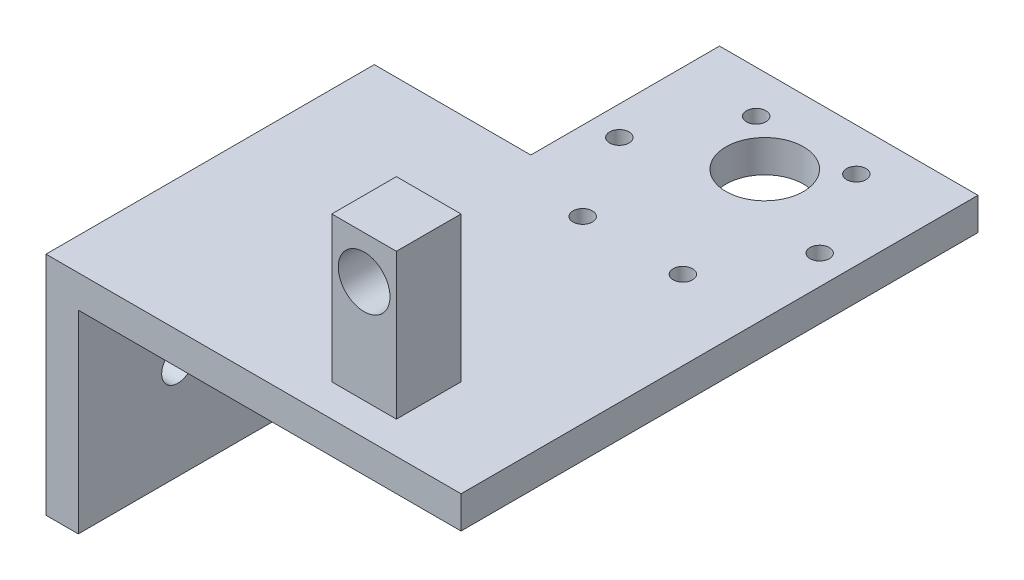
ISO-10303-21;
HEADER;
FILE_DESCRIPTION(('STEP AP214'),'2;1');
FILE_NAME('part.step','',(''),(''),'','','');
FILE_SCHEMA(('AUTOMOTIVE_DESIGN { 1 0 10303 214 1 1 1 1 }'));
ENDSEC;
DATA;
#1=APPLICATION_CONTEXT('core data for automotive mechanical design processes');
#2=APPLICATION_PROTOCOL_DEFINITION('international standard','automotive_design',2000,#1);
#3=PRODUCT_CONTEXT('',#1,'mechanical');
#4=PRODUCT('Part','Part','',(#3));
#5=PRODUCT_RELATED_PRODUCT_CATEGORY('part','',(#4));
#6=PRODUCT_DEFINITION_FORMATION('','',#4);
#7=PRODUCT_DEFINITION_CONTEXT('part definition',#1,'design');
#8=PRODUCT_DEFINITION('design','',#6,#7);
#9=PRODUCT_DEFINITION_SHAPE('','',#8);
#10=(LENGTH_UNIT() NAMED_UNIT(*) SI_UNIT(.MILLI.,.METRE.));
#11=(NAMED_UNIT(*) PLANE_ANGLE_UNIT() SI_UNIT($,.RADIAN.));
#12=(NAMED_UNIT(*) SI_UNIT($,.STERADIAN.) SOLID_ANGLE_UNIT());
#13=UNCERTAINTY_MEASURE_WITH_UNIT(LENGTH_MEASURE(1.E-05),#10,'distance_accuracy_value','');
#14=(GEOMETRIC_REPRESENTATION_CONTEXT(3) GLOBAL_UNCERTAINTY_ASSIGNED_CONTEXT((#13)) GLOBAL_UNIT_ASSIGNED_CONTEXT((#10,
#11,#12)) REPRESENTATION_CONTEXT('',''));
#15=CARTESIAN_POINT('',(0.,0.,0.));
#16=DIRECTION('',(0.,0.,1.));
#17=DIRECTION('',(1.,0.,0.));
#18=AXIS2_PLACEMENT_3D('',#15,#16,#17);
#19=CARTESIAN_POINT('',(0.,0.,0.));
#20=DIRECTION('',(0.,1.,0.));
#21=DIRECTION('',(0.,0.,1.));
#22=AXIS2_PLACEMENT_3D('',#19,#20,#21);
#23=PLANE('',#22);
#24=CARTESIAN_POINT('',(-15.5,0.,0.));
#25=DIRECTION('',(0.,1.,0.));
#26=DIRECTION('',(0.,0.,1.));
#27=AXIS2_PLACEMENT_3D('',#24,#25,#26);
#28=CIRCLE('',#27,1.5);
#29=CARTESIAN_POINT('',(-15.5,0.,1.5));
#30=VERTEX_POINT('',#29);
#31=EDGE_CURVE('E232',#30,#30,#28,.T.);
#32=ORIENTED_EDGE('',*,*,#31,.T.);
#33=EDGE_LOOP('',(#32));
#34=FACE_BOUND('',#33,.T.);
#35=CARTESIAN_POINT('',(7.75000000000006,0.,-13.4233937586588));
#36=DIRECTION('',(0.,1.,0.));
#37=DIRECTION('',(0.,0.,1.));
#38=AXIS2_PLACEMENT_3D('',#35,#36,#37);
#39=CIRCLE('',#38,1.5);
#40=CARTESIAN_POINT('',(7.75000000000006,0.,-11.9233937586588));
#41=VERTEX_POINT('',#40);
#42=EDGE_CURVE('E202',#41,#41,#39,.T.);
#43=ORIENTED_EDGE('',*,*,#42,.T.);
#44=EDGE_LOOP('',(#43));
#45=FACE_BOUND('',#44,.T.);
#46=CARTESIAN_POINT('',(-7.74999999999997,0.,-13.4233937586588));
#47=DIRECTION('',(0.,1.,0.));
#48=DIRECTION('',(0.,0.,1.));
#49=AXIS2_PLACEMENT_3D('',#46,#47,#48);
#50=CIRCLE('',#49,1.5);
#51=CARTESIAN_POINT('',(-7.74999999999997,0.,-11.9233937586588));
#52=VERTEX_POINT('',#51);
#53=EDGE_CURVE('E221',#52,#52,#50,.T.);
#54=ORIENTED_EDGE('',*,*,#53,.T.);
#55=EDGE_LOOP('',(#54));
#56=FACE_BOUND('',#55,.T.);
#57=CARTESIAN_POINT('',(0.,0.,-7.));
#58=DIRECTION('',(0.,1.,0.));
#59=DIRECTION('',(0.,0.,1.));
#60=AXIS2_PLACEMENT_3D('',#57,#58,#59);
#61=CIRCLE('',#60,6.);
#62=CARTESIAN_POINT('',(0.,0.,-0.999999999999999));
#63=VERTEX_POINT('',#62);
#64=EDGE_CURVE('E220',#63,#63,#61,.T.);
#65=ORIENTED_EDGE('',*,*,#64,.T.);
#66=EDGE_LOOP('',(#65));
#67=FACE_BOUND('',#66,.T.);
#68=CARTESIAN_POINT('',(15.5,0.,1.08235921504137E-13));
#69=DIRECTION('',(0.,1.,0.));
#70=DIRECTION('',(0.,0.,1.));
#71=AXIS2_PLACEMENT_3D('',#68,#69,#70);
#72=CIRCLE('',#71,1.5);
#73=CARTESIAN_POINT('',(15.5,0.,1.50000000000011));
#74=VERTEX_POINT('',#73);
#75=EDGE_CURVE('E203',#74,#74,#72,.T.);
#76=ORIENTED_EDGE('',*,*,#75,.T.);
#77=EDGE_LOOP('',(#76));
#78=FACE_BOUND('',#77,.T.);
#79=CARTESIAN_POINT('',(7.74999999999987,0.,13.4233937586589));
#80=DIRECTION('',(0.,1.,0.));
#81=DIRECTION('',(0.,0.,1.));
#82=AXIS2_PLACEMENT_3D('',#79,#80,#81);
#83=CIRCLE('',#82,1.5);
#84=CARTESIAN_POINT('',(7.74999999999987,0.,14.9233937586589));
#85=VERTEX_POINT('',#84);
#86=EDGE_CURVE('E209',#85,#85,#83,.T.);
#87=ORIENTED_EDGE('',*,*,#86,.T.);
#88=EDGE_LOOP('',(#87));
#89=FACE_BOUND('',#88,.T.);
#90=CARTESIAN_POINT('',(-7.75000000000016,0.,13.4233937586587));
#91=DIRECTION('',(0.,1.,0.));
#92=DIRECTION('',(0.,0.,1.));
#93=AXIS2_PLACEMENT_3D('',#90,#91,#92);
#94=CIRCLE('',#93,1.5);
#95=CARTESIAN_POINT('',(-7.75000000000016,0.,14.9233937586587));
#96=VERTEX_POINT('',#95);
#97=EDGE_CURVE('E198',#96,#96,#94,.T.);
#98=ORIENTED_EDGE('',*,*,#97,.T.);
#99=EDGE_LOOP('',(#98));
#100=FACE_BOUND('',#99,.T.);
#101=DIRECTION('',(0.,0.,1.));
#102=VECTOR('',#101,1.);
#103=CARTESIAN_POINT('',(-39.225,0.,9.2));
#104=LINE('',#103,#102);
#105=CARTESIAN_POINT('',(-39.225,0.,9.2));
#106=VERTEX_POINT('',#105);
#107=CARTESIAN_POINT('',(-39.225,0.,60.));
#108=VERTEX_POINT('',#107);
#109=EDGE_CURVE('E48',#106,#108,#104,.T.);
#110=ORIENTED_EDGE('',*,*,#109,.F.);
#111=DIRECTION('',(1.,0.,0.));
#112=VECTOR('',#111,1.);
#113=CARTESIAN_POINT('',(-44.225,0.,9.2));
#114=LINE('',#113,#112);
#115=CARTESIAN_POINT('',(-20.,0.,9.2));
#116=VERTEX_POINT('',#115);
#117=EDGE_CURVE('E146',#106,#116,#114,.T.);
#118=ORIENTED_EDGE('',*,*,#117,.T.);
#119=DIRECTION('',(0.,0.,1.));
#120=VECTOR('',#119,1.);
#121=CARTESIAN_POINT('',(-20.,0.,-20.));
#122=LINE('',#121,#120);
#123=CARTESIAN_POINT('',(-20.,0.,-20.));
#124=VERTEX_POINT('',#123);
#125=EDGE_CURVE('E238',#124,#116,#122,.T.);
#126=ORIENTED_EDGE('',*,*,#125,.F.);
#127=DIRECTION('',(-1.,0.,0.));
#128=VECTOR('',#127,1.);
#129=CARTESIAN_POINT('',(-20.,0.,-20.));
#130=LINE('',#129,#128);
#131=CARTESIAN_POINT('',(20.,0.,-20.));
#132=VERTEX_POINT('',#131);
#133=EDGE_CURVE('E244',#132,#124,#130,.T.);
#134=ORIENTED_EDGE('',*,*,#133,.F.);
#135=DIRECTION('',(0.,0.,-1.));
#136=VECTOR('',#135,1.);
#137=CARTESIAN_POINT('',(20.,0.,-20.));
#138=LINE('',#137,#136);
#139=CARTESIAN_POINT('',(20.,0.,60.));
#140=VERTEX_POINT('',#139);
#141=EDGE_CURVE('E254',#140,#132,#138,.T.);
#142=ORIENTED_EDGE('',*,*,#141,.F.);
#143=DIRECTION('',(1.,0.,0.));
#144=VECTOR('',#143,1.);
#145=CARTESIAN_POINT('',(-20.,0.,60.));
#146=LINE('',#145,#144);
#147=EDGE_CURVE('E252',#108,#140,#146,.T.);
#148=ORIENTED_EDGE('',*,*,#147,.F.);
#149=EDGE_LOOP('',(#110,#118,#126,#134,#142,#148));
#150=FACE_BOUND('',#149,.T.);
#151=ADVANCED_FACE('F33',(#34,#45,#56,#67,#78,#89,#100,#150),#23,.F.);
#152=CARTESIAN_POINT('',(-20.,5.,-20.));
#153=DIRECTION('',(1.,0.,0.));
#154=DIRECTION('',(0.,0.,-1.));
#155=AXIS2_PLACEMENT_3D('',#152,#153,#154);
#156=PLANE('',#155);
#157=DIRECTION('',(0.,-1.,0.));
#158=VECTOR('',#157,1.);
#159=CARTESIAN_POINT('',(-20.,0.,9.2));
#160=LINE('',#159,#158);
#161=CARTESIAN_POINT('',(-20.,5.,9.2));
#162=VERTEX_POINT('',#161);
#163=EDGE_CURVE('E56',#162,#116,#160,.T.);
#164=ORIENTED_EDGE('',*,*,#163,.F.);
#165=DIRECTION('',(0.,0.,1.));
#166=VECTOR('',#165,1.);
#167=CARTESIAN_POINT('',(-20.,5.,-20.));
#168=LINE('',#167,#166);
#169=CARTESIAN_POINT('',(-20.,5.,-20.));
#170=VERTEX_POINT('',#169);
#171=EDGE_CURVE('E241',#170,#162,#168,.T.);
#172=ORIENTED_EDGE('',*,*,#171,.F.);
#173=DIRECTION('',(0.,-1.,0.));
#174=VECTOR('',#173,1.);
#175=CARTESIAN_POINT('',(-20.,5.,-20.));
#176=LINE('',#175,#174);
#177=EDGE_CURVE('E250',#170,#124,#176,.T.);
#178=ORIENTED_EDGE('',*,*,#177,.T.);
#179=ORIENTED_EDGE('',*,*,#125,.T.);
#180=EDGE_LOOP('',(#164,#172,#178,#179));
#181=FACE_BOUND('',#180,.T.);
#182=ADVANCED_FACE('F35',(#181),#156,.F.);
#183=CARTESIAN_POINT('',(0.,5.,0.));
#184=DIRECTION('',(0.,1.,0.));
#185=DIRECTION('',(0.,0.,1.));
#186=AXIS2_PLACEMENT_3D('',#183,#184,#185);
#187=PLANE('',#186);
#188=CARTESIAN_POINT('',(-7.75000000000016,5.,13.4233937586587));
#189=DIRECTION('',(0.,1.,0.));
#190=DIRECTION('',(0.,0.,1.));
#191=AXIS2_PLACEMENT_3D('',#188,#189,#190);
#192=CIRCLE('',#191,1.5);
#193=CARTESIAN_POINT('',(-7.75000000000016,5.,14.9233937586587));
#194=VERTEX_POINT('',#193);
#195=EDGE_CURVE('E212',#194,#194,#192,.T.);
#196=ORIENTED_EDGE('',*,*,#195,.F.);
#197=EDGE_LOOP('',(#196));
#198=FACE_BOUND('',#197,.T.);
#199=CARTESIAN_POINT('',(7.74999999999987,5.,13.4233937586589));
#200=DIRECTION('',(0.,1.,0.));
#201=DIRECTION('',(0.,0.,1.));
#202=AXIS2_PLACEMENT_3D('',#199,#200,#201);
#203=CIRCLE('',#202,1.5);
#204=CARTESIAN_POINT('',(7.74999999999987,5.,14.9233937586589));
#205=VERTEX_POINT('',#204);
#206=EDGE_CURVE('E206',#205,#205,#203,.T.);
#207=ORIENTED_EDGE('',*,*,#206,.F.);
#208=EDGE_LOOP('',(#207));
#209=FACE_BOUND('',#208,.T.);
#210=CARTESIAN_POINT('',(15.5,5.,1.08235921504137E-13));
#211=DIRECTION('',(0.,1.,0.));
#212=DIRECTION('',(0.,0.,1.));
#213=AXIS2_PLACEMENT_3D('',#210,#211,#212);
#214=CIRCLE('',#213,1.5);
#215=CARTESIAN_POINT('',(15.5,5.,1.50000000000011));
#216=VERTEX_POINT('',#215);
#217=EDGE_CURVE('E199',#216,#216,#214,.T.);
#218=ORIENTED_EDGE('',*,*,#217,.F.);
#219=EDGE_LOOP('',(#218));
#220=FACE_BOUND('',#219,.T.);
#221=CARTESIAN_POINT('',(0.,5.,-7.));
#222=DIRECTION('',(0.,1.,0.));
#223=DIRECTION('',(0.,0.,1.));
#224=AXIS2_PLACEMENT_3D('',#221,#222,#223);
#225=CIRCLE('',#224,6.);
#226=CARTESIAN_POINT('',(0.,5.,-0.999999999999999));
#227=VERTEX_POINT('',#226);
#228=EDGE_CURVE('E229',#227,#227,#225,.T.);
#229=ORIENTED_EDGE('',*,*,#228,.F.);
#230=EDGE_LOOP('',(#229));
#231=FACE_BOUND('',#230,.T.);
#232=CARTESIAN_POINT('',(-7.74999999999997,5.,-13.4233937586588));
#233=DIRECTION('',(0.,1.,0.));
#234=DIRECTION('',(0.,0.,1.));
#235=AXIS2_PLACEMENT_3D('',#232,#233,#234);
#236=CIRCLE('',#235,1.5);
#237=CARTESIAN_POINT('',(-7.74999999999997,5.,-11.9233937586588));
#238=VERTEX_POINT('',#237);
#239=EDGE_CURVE('E217',#238,#238,#236,.T.);
#240=ORIENTED_EDGE('',*,*,#239,.F.);
#241=EDGE_LOOP('',(#240));
#242=FACE_BOUND('',#241,.T.);
#243=CARTESIAN_POINT('',(7.75000000000006,5.,-13.4233937586588));
#244=DIRECTION('',(0.,1.,0.));
#245=DIRECTION('',(0.,0.,1.));
#246=AXIS2_PLACEMENT_3D('',#243,#244,#245);
#247=CIRCLE('',#246,1.5);
#248=CARTESIAN_POINT('',(7.75000000000006,5.,-11.9233937586588));
#249=VERTEX_POINT('',#248);
#250=EDGE_CURVE('E224',#249,#249,#247,.T.);
#251=ORIENTED_EDGE('',*,*,#250,.F.);
#252=EDGE_LOOP('',(#251));
#253=FACE_BOUND('',#252,.T.);
#254=CARTESIAN_POINT('',(-15.5,5.,0.));
#255=DIRECTION('',(0.,1.,0.));
#256=DIRECTION('',(0.,0.,1.));
#257=AXIS2_PLACEMENT_3D('',#254,#255,#256);
#258=CIRCLE('',#257,1.5);
#259=CARTESIAN_POINT('',(-15.5,5.,1.5));
#260=VERTEX_POINT('',#259);
#261=EDGE_CURVE('E235',#260,#260,#258,.T.);
#262=ORIENTED_EDGE('',*,*,#261,.F.);
#263=EDGE_LOOP('',(#262));
#264=FACE_BOUND('',#263,.T.);
#265=ORIENTED_EDGE('',*,*,#171,.T.);
#266=DIRECTION('',(1.,0.,0.));
#267=VECTOR('',#266,1.);
#268=CARTESIAN_POINT('',(-44.225,5.,9.2));
#269=LINE('',#268,#267);
#270=CARTESIAN_POINT('',(-44.225,5.,9.2));
#271=VERTEX_POINT('',#270);
#272=EDGE_CURVE('E160',#271,#162,#269,.T.);
#273=ORIENTED_EDGE('',*,*,#272,.F.);
#274=DIRECTION('',(0.,0.,-1.));
#275=VECTOR('',#274,1.);
#276=CARTESIAN_POINT('',(-44.225,5.,60.));
#277=LINE('',#276,#275);
#278=CARTESIAN_POINT('',(-44.225,5.,60.));
#279=VERTEX_POINT('',#278);
#280=EDGE_CURVE('E155',#279,#271,#277,.T.);
#281=ORIENTED_EDGE('',*,*,#280,.F.);
#282=DIRECTION('',(1.,0.,0.));
#283=VECTOR('',#282,1.);
#284=CARTESIAN_POINT('',(-20.,5.,60.));
#285=LINE('',#284,#283);
#286=CARTESIAN_POINT('',(20.,5.,60.));
#287=VERTEX_POINT('',#286);
#288=EDGE_CURVE('E243',#279,#287,#285,.T.);
#289=ORIENTED_EDGE('',*,*,#288,.T.);
#290=DIRECTION('',(0.,0.,-1.));
#291=VECTOR('',#290,1.);
#292=CARTESIAN_POINT('',(20.,5.,-20.));
#293=LINE('',#292,#291);
#294=CARTESIAN_POINT('',(20.,5.,-20.));
#295=VERTEX_POINT('',#294);
#296=EDGE_CURVE('E246',#287,#295,#293,.T.);
#297=ORIENTED_EDGE('',*,*,#296,.T.);
#298=DIRECTION('',(-1.,0.,0.));
#299=VECTOR('',#298,1.);
#300=CARTESIAN_POINT('',(-20.,5.,-20.));
#301=LINE('',#300,#299);
#302=EDGE_CURVE('E248',#295,#170,#301,.T.);
#303=ORIENTED_EDGE('',*,*,#302,.T.);
#304=EDGE_LOOP('',(#265,#273,#281,#289,#297,#303));
#305=FACE_BOUND('',#304,.T.);
#306=DIRECTION('',(-1.,0.,0.));
#307=VECTOR('',#306,1.);
#308=CARTESIAN_POINT('',(5.00000000000001,5.,45.));
#309=LINE('',#308,#307);
#310=CARTESIAN_POINT('',(5.00000000000001,5.,45.));
#311=VERTEX_POINT('',#310);
#312=CARTESIAN_POINT('',(-4.99999999999999,5.,45.));
#313=VERTEX_POINT('',#312);
#314=EDGE_CURVE('E183',#311,#313,#309,.T.);
#315=ORIENTED_EDGE('',*,*,#314,.F.);
#316=DIRECTION('',(0.,0.,-1.));
#317=VECTOR('',#316,1.);
#318=CARTESIAN_POINT('',(5.00000000000001,5.,45.));
#319=LINE('',#318,#317);
#320=CARTESIAN_POINT('',(5.00000000000001,5.,55.));
#321=VERTEX_POINT('',#320);
#322=EDGE_CURVE('E167',#321,#311,#319,.T.);
#323=ORIENTED_EDGE('',*,*,#322,.F.);
#324=DIRECTION('',(1.,0.,0.));
#325=VECTOR('',#324,1.);
#326=CARTESIAN_POINT('',(5.00000000000001,5.,55.));
#327=LINE('',#326,#325);
#328=CARTESIAN_POINT('',(-4.99999999999999,5.,55.));
#329=VERTEX_POINT('',#328);
#330=EDGE_CURVE('E174',#329,#321,#327,.T.);
#331=ORIENTED_EDGE('',*,*,#330,.F.);
#332=DIRECTION('',(0.,0.,1.));
#333=VECTOR('',#332,1.);
#334=CARTESIAN_POINT('',(-4.99999999999999,5.,45.));
#335=LINE('',#334,#333);
#336=EDGE_CURVE('E185',#313,#329,#335,.T.);
#337=ORIENTED_EDGE('',*,*,#336,.F.);
#338=EDGE_LOOP('',(#315,#323,#331,#337));
#339=FACE_BOUND('',#338,.T.);
#340=ADVANCED_FACE('F272',(#198,#209,#220,#231,#242,#253,#264,#305,#339),#187,.T.);
#341=CARTESIAN_POINT('',(-20.,5.,60.));
#342=DIRECTION('',(0.,0.,-1.));
#343=DIRECTION('',(-1.,0.,0.));
#344=AXIS2_PLACEMENT_3D('',#341,#342,#343);
#345=PLANE('',#344);
#346=DIRECTION('',(0.,1.,0.));
#347=VECTOR('',#346,1.);
#348=CARTESIAN_POINT('',(-44.225,0.,60.));
#349=LINE('',#348,#347);
#350=CARTESIAN_POINT('',(-44.225,-30.,60.));
#351=VERTEX_POINT('',#350);
#352=EDGE_CURVE('E148',#351,#279,#349,.T.);
#353=ORIENTED_EDGE('',*,*,#352,.F.);
#354=DIRECTION('',(1.,0.,0.));
#355=VECTOR('',#354,1.);
#356=CARTESIAN_POINT('',(-44.225,-30.,60.));
#357=LINE('',#356,#355);
#358=CARTESIAN_POINT('',(-39.225,-30.,60.));
#359=VERTEX_POINT('',#358);
#360=EDGE_CURVE('E134',#351,#359,#357,.T.);
#361=ORIENTED_EDGE('',*,*,#360,.T.);
#362=DIRECTION('',(0.,1.,0.));
#363=VECTOR('',#362,1.);
#364=CARTESIAN_POINT('',(-39.225,-30.,60.));
#365=LINE('',#364,#363);
#366=EDGE_CURVE('E130',#359,#108,#365,.T.);
#367=ORIENTED_EDGE('',*,*,#366,.T.);
#368=ORIENTED_EDGE('',*,*,#147,.T.);
#369=DIRECTION('',(0.,-1.,0.));
#370=VECTOR('',#369,1.);
#371=CARTESIAN_POINT('',(20.,5.,60.));
#372=LINE('',#371,#370);
#373=EDGE_CURVE('E11',#287,#140,#372,.T.);
#374=ORIENTED_EDGE('',*,*,#373,.F.);
#375=ORIENTED_EDGE('',*,*,#288,.F.);
#376=EDGE_LOOP('',(#353,#361,#367,#368,#374,#375));
#377=FACE_BOUND('',#376,.T.);
#378=ADVANCED_FACE('F277',(#377),#345,.F.);
#379=CARTESIAN_POINT('',(20.,5.,-20.));
#380=DIRECTION('',(-1.,0.,0.));
#381=DIRECTION('',(0.,0.,1.));
#382=AXIS2_PLACEMENT_3D('',#379,#380,#381);
#383=PLANE('',#382);
#384=ORIENTED_EDGE('',*,*,#141,.T.);
#385=DIRECTION('',(0.,-1.,0.));
#386=VECTOR('',#385,1.);
#387=CARTESIAN_POINT('',(20.,5.,-20.));
#388=LINE('',#387,#386);
#389=EDGE_CURVE('E41',#295,#132,#388,.T.);
#390=ORIENTED_EDGE('',*,*,#389,.F.);
#391=ORIENTED_EDGE('',*,*,#296,.F.);
#392=ORIENTED_EDGE('',*,*,#373,.T.);
#393=EDGE_LOOP('',(#384,#390,#391,#392));
#394=FACE_BOUND('',#393,.T.);
#395=ADVANCED_FACE('F275',(#394),#383,.F.);
#396=CARTESIAN_POINT('',(-20.,5.,-20.));
#397=DIRECTION('',(0.,0.,1.));
#398=DIRECTION('',(1.,0.,0.));
#399=AXIS2_PLACEMENT_3D('',#396,#397,#398);
#400=PLANE('',#399);
#401=ORIENTED_EDGE('',*,*,#133,.T.);
#402=ORIENTED_EDGE('',*,*,#177,.F.);
#403=ORIENTED_EDGE('',*,*,#302,.F.);
#404=ORIENTED_EDGE('',*,*,#389,.T.);
#405=EDGE_LOOP('',(#401,#402,#403,#404));
#406=FACE_BOUND('',#405,.T.);
#407=ADVANCED_FACE('F263',(#406),#400,.F.);
#408=CARTESIAN_POINT('',(-15.5,5.,0.));
#409=DIRECTION('',(0.,-1.,0.));
#410=DIRECTION('',(0.,0.,-1.));
#411=AXIS2_PLACEMENT_3D('',#408,#409,#410);
#412=CYLINDRICAL_SURFACE('',#411,1.5);
#413=ORIENTED_EDGE('',*,*,#261,.T.);
#414=EDGE_LOOP('',(#413));
#415=FACE_BOUND('',#414,.T.);
#416=ORIENTED_EDGE('',*,*,#31,.F.);
#417=EDGE_LOOP('',(#416));
#418=FACE_BOUND('',#417,.T.);
#419=ADVANCED_FACE('F326',(#415,#418),#412,.F.);
#420=CARTESIAN_POINT('',(7.75000000000006,5.,-13.4233937586588));
#421=DIRECTION('',(0.,-1.,0.));
#422=DIRECTION('',(0.,0.,-1.));
#423=AXIS2_PLACEMENT_3D('',#420,#421,#422);
#424=CYLINDRICAL_SURFACE('',#423,1.5);
#425=ORIENTED_EDGE('',*,*,#250,.T.);
#426=EDGE_LOOP('',(#425));
#427=FACE_BOUND('',#426,.T.);
#428=ORIENTED_EDGE('',*,*,#42,.F.);
#429=EDGE_LOOP('',(#428));
#430=FACE_BOUND('',#429,.T.);
#431=ADVANCED_FACE('F351',(#427,#430),#424,.F.);
#432=CARTESIAN_POINT('',(-7.74999999999997,5.,-13.4233937586588));
#433=DIRECTION('',(0.,-1.,0.));
#434=DIRECTION('',(0.,0.,-1.));
#435=AXIS2_PLACEMENT_3D('',#432,#433,#434);
#436=CYLINDRICAL_SURFACE('',#435,1.5);
#437=ORIENTED_EDGE('',*,*,#239,.T.);
#438=EDGE_LOOP('',(#437));
#439=FACE_BOUND('',#438,.T.);
#440=ORIENTED_EDGE('',*,*,#53,.F.);
#441=EDGE_LOOP('',(#440));
#442=FACE_BOUND('',#441,.T.);
#443=ADVANCED_FACE('F356',(#439,#442),#436,.F.);
#444=CARTESIAN_POINT('',(0.,5.,-7.));
#445=DIRECTION('',(0.,-1.,0.));
#446=DIRECTION('',(0.,0.,-1.));
#447=AXIS2_PLACEMENT_3D('',#444,#445,#446);
#448=CYLINDRICAL_SURFACE('',#447,6.);
#449=ORIENTED_EDGE('',*,*,#228,.T.);
#450=EDGE_LOOP('',(#449));
#451=FACE_BOUND('',#450,.T.);
#452=ORIENTED_EDGE('',*,*,#64,.F.);
#453=EDGE_LOOP('',(#452));
#454=FACE_BOUND('',#453,.T.);
#455=ADVANCED_FACE('F360',(#451,#454),#448,.F.);
#456=CARTESIAN_POINT('',(15.5,5.,1.08235921504137E-13));
#457=DIRECTION('',(0.,-1.,0.));
#458=DIRECTION('',(0.,0.,-1.));
#459=AXIS2_PLACEMENT_3D('',#456,#457,#458);
#460=CYLINDRICAL_SURFACE('',#459,1.5);
#461=ORIENTED_EDGE('',*,*,#217,.T.);
#462=EDGE_LOOP('',(#461));
#463=FACE_BOUND('',#462,.T.);
#464=ORIENTED_EDGE('',*,*,#75,.F.);
#465=EDGE_LOOP('',(#464));
#466=FACE_BOUND('',#465,.T.);
#467=ADVANCED_FACE('F362',(#463,#466),#460,.F.);
#468=CARTESIAN_POINT('',(7.74999999999987,5.,13.4233937586589));
#469=DIRECTION('',(0.,-1.,0.));
#470=DIRECTION('',(0.,0.,-1.));
#471=AXIS2_PLACEMENT_3D('',#468,#469,#470);
#472=CYLINDRICAL_SURFACE('',#471,1.5);
#473=ORIENTED_EDGE('',*,*,#206,.T.);
#474=EDGE_LOOP('',(#473));
#475=FACE_BOUND('',#474,.T.);
#476=ORIENTED_EDGE('',*,*,#86,.F.);
#477=EDGE_LOOP('',(#476));
#478=FACE_BOUND('',#477,.T.);
#479=ADVANCED_FACE('F372',(#475,#478),#472,.F.);
#480=CARTESIAN_POINT('',(-7.75000000000016,5.,13.4233937586587));
#481=DIRECTION('',(0.,-1.,0.));
#482=DIRECTION('',(0.,0.,-1.));
#483=AXIS2_PLACEMENT_3D('',#480,#481,#482);
#484=CYLINDRICAL_SURFACE('',#483,1.5);
#485=ORIENTED_EDGE('',*,*,#195,.T.);
#486=EDGE_LOOP('',(#485));
#487=FACE_BOUND('',#486,.T.);
#488=ORIENTED_EDGE('',*,*,#97,.F.);
#489=EDGE_LOOP('',(#488));
#490=FACE_BOUND('',#489,.T.);
#491=ADVANCED_FACE('F368',(#487,#490),#484,.F.);
#492=CARTESIAN_POINT('',(5.00000000000001,27.5,45.));
#493=DIRECTION('',(-1.,0.,0.));
#494=DIRECTION('',(0.,0.,1.));
#495=AXIS2_PLACEMENT_3D('',#492,#493,#494);
#496=PLANE('',#495);
#497=ORIENTED_EDGE('',*,*,#322,.T.);
#498=DIRECTION('',(0.,-1.,0.));
#499=VECTOR('',#498,1.);
#500=CARTESIAN_POINT('',(5.00000000000001,27.5,45.));
#501=LINE('',#500,#499);
#502=CARTESIAN_POINT('',(5.00000000000001,27.5,45.));
#503=VERTEX_POINT('',#502);
#504=EDGE_CURVE('E196',#503,#311,#501,.T.);
#505=ORIENTED_EDGE('',*,*,#504,.F.);
#506=DIRECTION('',(0.,0.,-1.));
#507=VECTOR('',#506,1.);
#508=CARTESIAN_POINT('',(5.00000000000001,27.5,45.));
#509=LINE('',#508,#507);
#510=CARTESIAN_POINT('',(5.00000000000001,27.5,55.));
#511=VERTEX_POINT('',#510);
#512=EDGE_CURVE('E170',#511,#503,#509,.T.);
#513=ORIENTED_EDGE('',*,*,#512,.F.);
#514=DIRECTION('',(0.,-1.,0.));
#515=VECTOR('',#514,1.);
#516=CARTESIAN_POINT('',(5.00000000000001,27.5,55.));
#517=LINE('',#516,#515);
#518=EDGE_CURVE('E180',#511,#321,#517,.T.);
#519=ORIENTED_EDGE('',*,*,#518,.T.);
#520=EDGE_LOOP('',(#497,#505,#513,#519));
#521=FACE_BOUND('',#520,.T.);
#522=ADVANCED_FACE('F371',(#521),#496,.F.);
#523=CARTESIAN_POINT('',(5.00000000000001,27.5,45.));
#524=DIRECTION('',(0.,0.,1.));
#525=DIRECTION('',(1.,0.,0.));
#526=AXIS2_PLACEMENT_3D('',#523,#524,#525);
#527=PLANE('',#526);
#528=ORIENTED_EDGE('',*,*,#314,.T.);
#529=DIRECTION('',(0.,-1.,0.));
#530=VECTOR('',#529,1.);
#531=CARTESIAN_POINT('',(-4.99999999999999,27.5,45.));
#532=LINE('',#531,#530);
#533=CARTESIAN_POINT('',(-4.99999999999999,27.5,45.));
#534=VERTEX_POINT('',#533);
#535=EDGE_CURVE('E193',#534,#313,#532,.T.);
#536=ORIENTED_EDGE('',*,*,#535,.F.);
#537=DIRECTION('',(-1.,0.,0.));
#538=VECTOR('',#537,1.);
#539=CARTESIAN_POINT('',(5.00000000000001,27.5,45.));
#540=LINE('',#539,#538);
#541=EDGE_CURVE('E173',#503,#534,#540,.T.);
#542=ORIENTED_EDGE('',*,*,#541,.F.);
#543=ORIENTED_EDGE('',*,*,#504,.T.);
#544=EDGE_LOOP('',(#528,#536,#542,#543));
#545=FACE_BOUND('',#544,.T.);
#546=ADVANCED_FACE('F382',(#545),#527,.F.);
#547=CARTESIAN_POINT('',(-4.99999999999999,27.5,45.));
#548=DIRECTION('',(1.,0.,0.));
#549=DIRECTION('',(0.,0.,-1.));
#550=AXIS2_PLACEMENT_3D('',#547,#548,#549);
#551=PLANE('',#550);
#552=ORIENTED_EDGE('',*,*,#336,.T.);
#553=DIRECTION('',(0.,-1.,0.));
#554=VECTOR('',#553,1.);
#555=CARTESIAN_POINT('',(-4.99999999999999,27.5,55.));
#556=LINE('',#555,#554);
#557=CARTESIAN_POINT('',(-4.99999999999999,27.5,55.));
#558=VERTEX_POINT('',#557);
#559=EDGE_CURVE('E191',#558,#329,#556,.T.);
#560=ORIENTED_EDGE('',*,*,#559,.F.);
#561=DIRECTION('',(0.,0.,1.));
#562=VECTOR('',#561,1.);
#563=CARTESIAN_POINT('',(-4.99999999999999,27.5,45.));
#564=LINE('',#563,#562);
#565=EDGE_CURVE('E176',#534,#558,#564,.T.);
#566=ORIENTED_EDGE('',*,*,#565,.F.);
#567=ORIENTED_EDGE('',*,*,#535,.T.);
#568=EDGE_LOOP('',(#552,#560,#566,#567));
#569=FACE_BOUND('',#568,.T.);
#570=ADVANCED_FACE('F386',(#569),#551,.F.);
#571=CARTESIAN_POINT('',(5.00000000000001,27.5,55.));
#572=DIRECTION('',(0.,0.,-1.));
#573=DIRECTION('',(-1.,0.,0.));
#574=AXIS2_PLACEMENT_3D('',#571,#572,#573);
#575=PLANE('',#574);
#576=CARTESIAN_POINT('',(0.,20.9,55.));
#577=DIRECTION('',(0.,0.,1.));
#578=DIRECTION('',(1.,0.,0.));
#579=AXIS2_PLACEMENT_3D('',#576,#577,#578);
#580=CIRCLE('',#579,4.);
#581=CARTESIAN_POINT('',(4.,20.9,55.));
#582=VERTEX_POINT('',#581);
#583=EDGE_CURVE('E163',#582,#582,#580,.T.);
#584=ORIENTED_EDGE('',*,*,#583,.F.);
#585=EDGE_LOOP('',(#584));
#586=FACE_BOUND('',#585,.T.);
#587=ORIENTED_EDGE('',*,*,#330,.T.);
#588=ORIENTED_EDGE('',*,*,#518,.F.);
#589=DIRECTION('',(1.,0.,0.));
#590=VECTOR('',#589,1.);
#591=CARTESIAN_POINT('',(5.00000000000001,27.5,55.));
#592=LINE('',#591,#590);
#593=EDGE_CURVE('E178',#558,#511,#592,.T.);
#594=ORIENTED_EDGE('',*,*,#593,.F.);
#595=ORIENTED_EDGE('',*,*,#559,.T.);
#596=EDGE_LOOP('',(#587,#588,#594,#595));
#597=FACE_BOUND('',#596,.T.);
#598=ADVANCED_FACE('F390',(#586,#597),#575,.F.);
#599=CARTESIAN_POINT('',(0.,27.5,0.));
#600=DIRECTION('',(0.,-1.,0.));
#601=DIRECTION('',(0.,0.,-1.));
#602=AXIS2_PLACEMENT_3D('',#599,#600,#601);
#603=PLANE('',#602);
#604=ORIENTED_EDGE('',*,*,#512,.T.);
#605=ORIENTED_EDGE('',*,*,#541,.T.);
#606=ORIENTED_EDGE('',*,*,#565,.T.);
#607=ORIENTED_EDGE('',*,*,#593,.T.);
#608=EDGE_LOOP('',(#604,#605,#606,#607));
#609=FACE_BOUND('',#608,.T.);
#610=ADVANCED_FACE('F394',(#609),#603,.F.);
#611=CARTESIAN_POINT('',(0.,20.9,47.));
#612=DIRECTION('',(0.,0.,1.));
#613=DIRECTION('',(1.,0.,0.));
#614=AXIS2_PLACEMENT_3D('',#611,#612,#613);
#615=CYLINDRICAL_SURFACE('',#614,4.);
#616=CARTESIAN_POINT('',(0.,20.9,47.));
#617=DIRECTION('',(0.,0.,1.));
#618=DIRECTION('',(1.,0.,0.));
#619=AXIS2_PLACEMENT_3D('',#616,#617,#618);
#620=CIRCLE('',#619,4.);
#621=CARTESIAN_POINT('',(4.,20.9,47.));
#622=VERTEX_POINT('',#621);
#623=EDGE_CURVE('E164',#622,#622,#620,.T.);
#624=ORIENTED_EDGE('',*,*,#623,.F.);
#625=EDGE_LOOP('',(#624));
#626=FACE_BOUND('',#625,.T.);
#627=ORIENTED_EDGE('',*,*,#583,.T.);
#628=EDGE_LOOP('',(#627));
#629=FACE_BOUND('',#628,.T.);
#630=ADVANCED_FACE('F398',(#626,#629),#615,.F.);
#631=CARTESIAN_POINT('',(0.,20.9,47.));
#632=DIRECTION('',(0.,0.,1.));
#633=DIRECTION('',(1.,0.,0.));
#634=AXIS2_PLACEMENT_3D('',#631,#632,#633);
#635=PLANE('',#634);
#636=ORIENTED_EDGE('',*,*,#623,.T.);
#637=EDGE_LOOP('',(#636));
#638=FACE_BOUND('',#637,.T.);
#639=ADVANCED_FACE('F402',(#638),#635,.T.);
#640=CARTESIAN_POINT('',(-44.225,0.,9.2));
#641=DIRECTION('',(0.,0.,1.));
#642=DIRECTION('',(1.,0.,0.));
#643=AXIS2_PLACEMENT_3D('',#640,#641,#642);
#644=PLANE('',#643);
#645=ORIENTED_EDGE('',*,*,#163,.T.);
#646=ORIENTED_EDGE('',*,*,#117,.F.);
#647=DIRECTION('',(0.,1.,0.));
#648=VECTOR('',#647,1.);
#649=CARTESIAN_POINT('',(-39.225,-30.,9.2));
#650=LINE('',#649,#648);
#651=CARTESIAN_POINT('',(-39.225,-30.,9.2));
#652=VERTEX_POINT('',#651);
#653=EDGE_CURVE('E128',#652,#106,#650,.T.);
#654=ORIENTED_EDGE('',*,*,#653,.F.);
#655=DIRECTION('',(1.,0.,0.));
#656=VECTOR('',#655,1.);
#657=CARTESIAN_POINT('',(-44.225,-30.,9.2));
#658=LINE('',#657,#656);
#659=CARTESIAN_POINT('',(-44.225,-30.,9.2));
#660=VERTEX_POINT('',#659);
#661=EDGE_CURVE('E135',#660,#652,#658,.T.);
#662=ORIENTED_EDGE('',*,*,#661,.F.);
#663=DIRECTION('',(0.,-1.,0.));
#664=VECTOR('',#663,1.);
#665=CARTESIAN_POINT('',(-44.225,0.,9.2));
#666=LINE('',#665,#664);
#667=EDGE_CURVE('E157',#271,#660,#666,.T.);
#668=ORIENTED_EDGE('',*,*,#667,.F.);
#669=ORIENTED_EDGE('',*,*,#272,.T.);
#670=EDGE_LOOP('',(#645,#646,#654,#662,#668,#669));
#671=FACE_BOUND('',#670,.T.);
#672=ADVANCED_FACE('F145',(#671),#644,.F.);
#673=CARTESIAN_POINT('',(-44.225,0.,0.));
#674=DIRECTION('',(-1.,0.,0.));
#675=DIRECTION('',(0.,0.,1.));
#676=AXIS2_PLACEMENT_3D('',#673,#674,#675);
#677=PLANE('',#676);
#678=CARTESIAN_POINT('',(-44.225,-15.,24.6));
#679=DIRECTION('',(-1.,0.,0.));
#680=DIRECTION('',(0.,0.,1.));
#681=AXIS2_PLACEMENT_3D('',#678,#679,#680);
#682=CIRCLE('',#681,2.5);
#683=CARTESIAN_POINT('',(-44.225,-15.,27.1));
#684=VERTEX_POINT('',#683);
#685=EDGE_CURVE('E290',#684,#684,#682,.T.);
#686=ORIENTED_EDGE('',*,*,#685,.F.);
#687=EDGE_LOOP('',(#686));
#688=FACE_BOUND('',#687,.T.);
#689=CARTESIAN_POINT('',(-44.225,-15.,44.6));
#690=DIRECTION('',(-1.,0.,0.));
#691=DIRECTION('',(0.,0.,1.));
#692=AXIS2_PLACEMENT_3D('',#689,#690,#691);
#693=CIRCLE('',#692,2.5);
#694=CARTESIAN_POINT('',(-44.225,-15.,47.1));
#695=VERTEX_POINT('',#694);
#696=EDGE_CURVE('E280',#695,#695,#693,.T.);
#697=ORIENTED_EDGE('',*,*,#696,.F.);
#698=EDGE_LOOP('',(#697));
#699=FACE_BOUND('',#698,.T.);
#700=ORIENTED_EDGE('',*,*,#352,.T.);
#701=ORIENTED_EDGE('',*,*,#280,.T.);
#702=ORIENTED_EDGE('',*,*,#667,.T.);
#703=DIRECTION('',(0.,0.,1.));
#704=VECTOR('',#703,1.);
#705=CARTESIAN_POINT('',(-44.225,-30.,9.2));
#706=LINE('',#705,#704);
#707=EDGE_CURVE('E141',#660,#351,#706,.T.);
#708=ORIENTED_EDGE('',*,*,#707,.T.);
#709=EDGE_LOOP('',(#700,#701,#702,#708));
#710=FACE_BOUND('',#709,.T.);
#711=ADVANCED_FACE('F296',(#688,#699,#710),#677,.T.);
#712=CARTESIAN_POINT('',(-39.225,-30.,9.2));
#713=DIRECTION('',(-1.,0.,0.));
#714=DIRECTION('',(0.,0.,1.));
#715=AXIS2_PLACEMENT_3D('',#712,#713,#714);
#716=PLANE('',#715);
#717=CARTESIAN_POINT('',(-39.225,-15.,24.6));
#718=DIRECTION('',(-1.,0.,0.));
#719=DIRECTION('',(0.,0.,1.));
#720=AXIS2_PLACEMENT_3D('',#717,#718,#719);
#721=CIRCLE('',#720,2.5);
#722=CARTESIAN_POINT('',(-39.225,-15.,27.1));
#723=VERTEX_POINT('',#722);
#724=EDGE_CURVE('E287',#723,#723,#721,.F.);
#725=ORIENTED_EDGE('',*,*,#724,.F.);
#726=EDGE_LOOP('',(#725));
#727=FACE_BOUND('',#726,.T.);
#728=CARTESIAN_POINT('',(-39.225,-15.,44.6));
#729=DIRECTION('',(-1.,0.,0.));
#730=DIRECTION('',(0.,0.,1.));
#731=AXIS2_PLACEMENT_3D('',#728,#729,#730);
#732=CIRCLE('',#731,2.5);
#733=CARTESIAN_POINT('',(-39.225,-15.,47.1));
#734=VERTEX_POINT('',#733);
#735=EDGE_CURVE('E278',#734,#734,#732,.F.);
#736=ORIENTED_EDGE('',*,*,#735,.F.);
#737=EDGE_LOOP('',(#736));
#738=FACE_BOUND('',#737,.T.);
#739=ORIENTED_EDGE('',*,*,#109,.T.);
#740=ORIENTED_EDGE('',*,*,#366,.F.);
#741=DIRECTION('',(0.,0.,1.));
#742=VECTOR('',#741,1.);
#743=CARTESIAN_POINT('',(-39.225,-30.,9.2));
#744=LINE('',#743,#742);
#745=EDGE_CURVE('E124',#652,#359,#744,.T.);
#746=ORIENTED_EDGE('',*,*,#745,.F.);
#747=ORIENTED_EDGE('',*,*,#653,.T.);
#748=EDGE_LOOP('',(#739,#740,#746,#747));
#749=FACE_BOUND('',#748,.T.);
#750=ADVANCED_FACE('F126',(#727,#738,#749),#716,.F.);
#751=CARTESIAN_POINT('',(0.,-30.,0.));
#752=DIRECTION('',(0.,-1.,0.));
#753=DIRECTION('',(0.,0.,-1.));
#754=AXIS2_PLACEMENT_3D('',#751,#752,#753);
#755=PLANE('',#754);
#756=ORIENTED_EDGE('',*,*,#661,.T.);
#757=ORIENTED_EDGE('',*,*,#745,.T.);
#758=ORIENTED_EDGE('',*,*,#360,.F.);
#759=ORIENTED_EDGE('',*,*,#707,.F.);
#760=EDGE_LOOP('',(#756,#757,#758,#759));
#761=FACE_BOUND('',#760,.T.);
#762=ADVANCED_FACE('F139',(#761),#755,.T.);
#763=CARTESIAN_POINT('',(-32.1539321881345,-15.,44.6));
#764=DIRECTION('',(-1.,0.,0.));
#765=DIRECTION('',(0.,0.,1.));
#766=AXIS2_PLACEMENT_3D('',#763,#764,#765);
#767=CYLINDRICAL_SURFACE('',#766,2.5);
#768=ORIENTED_EDGE('',*,*,#735,.T.);
#769=EDGE_LOOP('',(#768));
#770=FACE_BOUND('',#769,.T.);
#771=ORIENTED_EDGE('',*,*,#696,.T.);
#772=EDGE_LOOP('',(#771));
#773=FACE_BOUND('',#772,.T.);
#774=ADVANCED_FACE('F303',(#770,#773),#767,.F.);
#775=CARTESIAN_POINT('',(-32.1539321881345,-15.,24.6));
#776=DIRECTION('',(-1.,0.,0.));
#777=DIRECTION('',(0.,0.,1.));
#778=AXIS2_PLACEMENT_3D('',#775,#776,#777);
#779=CYLINDRICAL_SURFACE('',#778,2.5);
#780=ORIENTED_EDGE('',*,*,#724,.T.);
#781=EDGE_LOOP('',(#780));
#782=FACE_BOUND('',#781,.T.);
#783=ORIENTED_EDGE('',*,*,#685,.T.);
#784=EDGE_LOOP('',(#783));
#785=FACE_BOUND('',#784,.T.);
#786=ADVANCED_FACE('F294',(#782,#785),#779,.F.);
#787=CLOSED_SHELL('',(#151,#182,#340,#378,#395,#407,#419,#431,#443,#455,#467,#479,#491,#522,
#546,#570,#598,#610,#630,#639,#672,#711,#750,#762,#774,#786));
#788=MANIFOLD_SOLID_BREP('B2',#787);
#789=ADVANCED_BREP_SHAPE_REPRESENTATION('',(#18,#788),#14);
#790=SHAPE_DEFINITION_REPRESENTATION(#9,#789);
ENDSEC;
END-ISO-10303-21;
